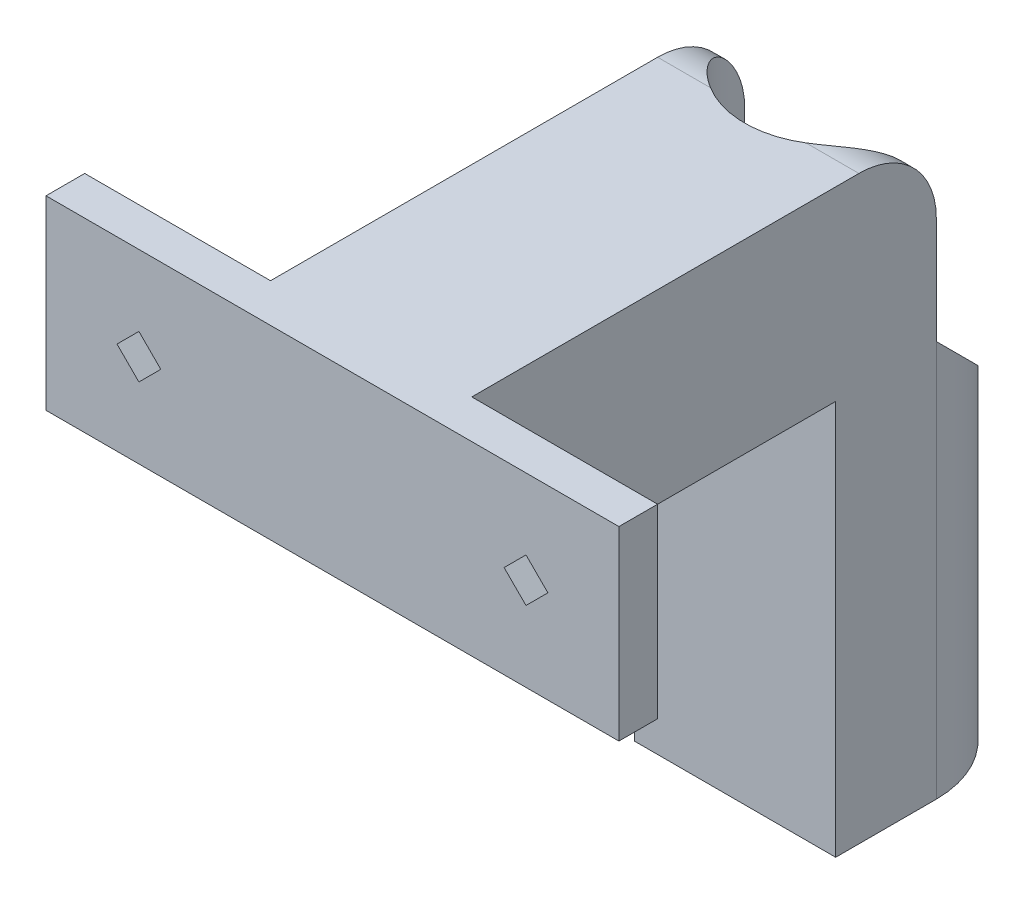
ISO-10303-21;
HEADER;
FILE_DESCRIPTION(('STEP AP214'),'2;1');
FILE_NAME('part.step','',(''),(''),'','','');
FILE_SCHEMA(('AUTOMOTIVE_DESIGN { 1 0 10303 214 1 1 1 1 }'));
ENDSEC;
DATA;
#1=APPLICATION_CONTEXT('core data for automotive mechanical design processes');
#2=APPLICATION_PROTOCOL_DEFINITION('international standard','automotive_design',2000,#1);
#3=PRODUCT_CONTEXT('',#1,'mechanical');
#4=PRODUCT('Part','Part','',(#3));
#5=PRODUCT_RELATED_PRODUCT_CATEGORY('part','',(#4));
#6=PRODUCT_DEFINITION_FORMATION('','',#4);
#7=PRODUCT_DEFINITION_CONTEXT('part definition',#1,'design');
#8=PRODUCT_DEFINITION('design','',#6,#7);
#9=PRODUCT_DEFINITION_SHAPE('','',#8);
#10=(LENGTH_UNIT() NAMED_UNIT(*) SI_UNIT(.MILLI.,.METRE.));
#11=(NAMED_UNIT(*) PLANE_ANGLE_UNIT() SI_UNIT($,.RADIAN.));
#12=(NAMED_UNIT(*) SI_UNIT($,.STERADIAN.) SOLID_ANGLE_UNIT());
#13=UNCERTAINTY_MEASURE_WITH_UNIT(LENGTH_MEASURE(1.E-05),#10,'distance_accuracy_value','');
#14=(GEOMETRIC_REPRESENTATION_CONTEXT(3) GLOBAL_UNCERTAINTY_ASSIGNED_CONTEXT((#13)) GLOBAL_UNIT_ASSIGNED_CONTEXT((#10,
#11,#12)) REPRESENTATION_CONTEXT('',''));
#15=CARTESIAN_POINT('',(0.,0.,0.));
#16=DIRECTION('',(0.,0.,1.));
#17=DIRECTION('',(1.,0.,0.));
#18=AXIS2_PLACEMENT_3D('',#15,#16,#17);
#19=CARTESIAN_POINT('',(0.,1.2,0.));
#20=DIRECTION('',(0.,-1.,0.));
#21=DIRECTION('',(0.,0.,-1.));
#22=AXIS2_PLACEMENT_3D('',#19,#20,#21);
#23=CYLINDRICAL_SURFACE('',#22,13.);
#24=CARTESIAN_POINT('',(0.,51.2,0.));
#25=DIRECTION('',(0.,-0.707106781186547,0.707106781186547));
#26=DIRECTION('',(0.,-0.707106781186548,-0.707106781186548));
#27=AXIS2_PLACEMENT_3D('',#24,#25,#26);
#28=ELLIPSE('',#27,18.3847763108502,13.);
#29=CARTESIAN_POINT('',(-13.,51.2,0.));
#30=VERTEX_POINT('',#29);
#31=CARTESIAN_POINT('',(13.,51.2,0.));
#32=VERTEX_POINT('',#31);
#33=EDGE_CURVE('E217',#30,#32,#28,.T.);
#34=ORIENTED_EDGE('',*,*,#33,.T.);
#35=DIRECTION('',(0.,-1.,0.));
#36=VECTOR('',#35,1.);
#37=CARTESIAN_POINT('',(13.,75.,0.));
#38=LINE('',#37,#36);
#39=CARTESIAN_POINT('',(13.,0.,0.));
#40=VERTEX_POINT('',#39);
#41=EDGE_CURVE('E253',#32,#40,#38,.T.);
#42=ORIENTED_EDGE('',*,*,#41,.T.);
#43=CARTESIAN_POINT('',(0.,0.,0.));
#44=DIRECTION('',(0.,1.,0.));
#45=DIRECTION('',(0.,0.,1.));
#46=AXIS2_PLACEMENT_3D('',#43,#44,#45);
#47=CIRCLE('',#46,13.);
#48=CARTESIAN_POINT('',(-13.,0.,0.));
#49=VERTEX_POINT('',#48);
#50=EDGE_CURVE('E238',#40,#49,#47,.T.);
#51=ORIENTED_EDGE('',*,*,#50,.T.);
#52=DIRECTION('',(0.,-1.,0.));
#53=VECTOR('',#52,1.);
#54=CARTESIAN_POINT('',(-13.,75.,0.));
#55=LINE('',#54,#53);
#56=EDGE_CURVE('E206',#30,#49,#55,.T.);
#57=ORIENTED_EDGE('',*,*,#56,.F.);
#58=EDGE_LOOP('',(#34,#42,#51,#57));
#59=FACE_BOUND('',#58,.T.);
#60=ADVANCED_FACE('F47',(#59),#23,.T.);
#61=CARTESIAN_POINT('',(0.,0.,0.));
#62=DIRECTION('',(0.,1.,0.));
#63=DIRECTION('',(0.,0.,1.));
#64=AXIS2_PLACEMENT_3D('',#61,#62,#63);
#65=PLANE('',#64);
#66=DIRECTION('',(0.,0.,-1.));
#67=VECTOR('',#66,1.);
#68=CARTESIAN_POINT('',(-13.,0.,0.));
#69=LINE('',#68,#67);
#70=CARTESIAN_POINT('',(-13.,0.,13.));
#71=VERTEX_POINT('',#70);
#72=EDGE_CURVE('E245',#71,#49,#69,.T.);
#73=ORIENTED_EDGE('',*,*,#72,.T.);
#74=ORIENTED_EDGE('',*,*,#50,.F.);
#75=DIRECTION('',(0.,0.,1.));
#76=VECTOR('',#75,1.);
#77=CARTESIAN_POINT('',(13.,0.,13.));
#78=LINE('',#77,#76);
#79=CARTESIAN_POINT('',(13.,0.,13.));
#80=VERTEX_POINT('',#79);
#81=EDGE_CURVE('E501',#40,#80,#78,.T.);
#82=ORIENTED_EDGE('',*,*,#81,.T.);
#83=DIRECTION('',(-1.,0.,0.));
#84=VECTOR('',#83,1.);
#85=CARTESIAN_POINT('',(-13.,0.,13.));
#86=LINE('',#85,#84);
#87=EDGE_CURVE('E516',#80,#71,#86,.T.);
#88=ORIENTED_EDGE('',*,*,#87,.T.);
#89=EDGE_LOOP('',(#73,#74,#82,#88));
#90=FACE_BOUND('',#89,.T.);
#91=CARTESIAN_POINT('',(0.,0.,0.));
#92=DIRECTION('',(0.,1.,0.));
#93=DIRECTION('',(0.,0.,1.));
#94=AXIS2_PLACEMENT_3D('',#91,#92,#93);
#95=CIRCLE('',#94,11.25);
#96=CARTESIAN_POINT('',(0.,0.,11.25));
#97=VERTEX_POINT('',#96);
#98=EDGE_CURVE('E265',#97,#97,#95,.T.);
#99=ORIENTED_EDGE('',*,*,#98,.T.);
#100=EDGE_LOOP('',(#99));
#101=FACE_BOUND('',#100,.T.);
#102=ADVANCED_FACE('F312',(#90,#101),#65,.F.);
#103=CARTESIAN_POINT('',(0.,1.2,0.));
#104=DIRECTION('',(0.,-1.,0.));
#105=DIRECTION('',(0.,0.,-1.));
#106=AXIS2_PLACEMENT_3D('',#103,#104,#105);
#107=CYLINDRICAL_SURFACE('',#106,11.25);
#108=CARTESIAN_POINT('',(0.,0.699999999999999,0.));
#109=DIRECTION('',(0.,1.,0.));
#110=DIRECTION('',(0.,0.,1.));
#111=AXIS2_PLACEMENT_3D('',#108,#109,#110);
#112=CIRCLE('',#111,11.25);
#113=CARTESIAN_POINT('',(0.,0.699999999999999,11.25));
#114=VERTEX_POINT('',#113);
#115=EDGE_CURVE('E271',#114,#114,#112,.T.);
#116=ORIENTED_EDGE('',*,*,#115,.T.);
#117=EDGE_LOOP('',(#116));
#118=FACE_BOUND('',#117,.T.);
#119=ORIENTED_EDGE('',*,*,#98,.F.);
#120=EDGE_LOOP('',(#119));
#121=FACE_BOUND('',#120,.T.);
#122=ADVANCED_FACE('F306',(#118,#121),#107,.F.);
#123=CARTESIAN_POINT('',(0.,51.2,0.));
#124=DIRECTION('',(0.,-1.,0.));
#125=DIRECTION('',(0.,0.,-1.));
#126=AXIS2_PLACEMENT_3D('',#123,#124,#125);
#127=CYLINDRICAL_SURFACE('',#126,11.75);
#128=CARTESIAN_POINT('',(0.,75.,0.));
#129=DIRECTION('',(0.,1.,0.));
#130=DIRECTION('',(0.,0.,-1.));
#131=AXIS2_PLACEMENT_3D('',#128,#129,#130);
#132=CIRCLE('',#131,11.75);
#133=CARTESIAN_POINT('',(-6.16948133962654,75.,10.));
#134=VERTEX_POINT('',#133);
#135=CARTESIAN_POINT('',(6.16948133962654,75.,10.));
#136=VERTEX_POINT('',#135);
#137=EDGE_CURVE('E506',#134,#136,#132,.T.);
#138=ORIENTED_EDGE('',*,*,#137,.T.);
#139=CARTESIAN_POINT('',(6.16948133962654,75.,10.));
#140=CARTESIAN_POINT('',(6.40266158098199,74.9999830141259,9.85618063766226));
#141=CARTESIAN_POINT('',(6.63083102619058,74.9968963019697,9.7041137604221));
#142=CARTESIAN_POINT('',(7.07599475002163,74.9823246021824,9.38444110487097));
#143=CARTESIAN_POINT('',(7.29297990457547,74.9708328703382,9.2168229425245));
#144=CARTESIAN_POINT('',(7.71553908185714,74.9370815288869,8.8661624616111));
#145=CARTESIAN_POINT('',(7.9210346431708,74.9147560740994,8.68303155207486));
#146=CARTESIAN_POINT('',(8.3176933753886,74.8569671825217,8.30383726938138));
#147=CARTESIAN_POINT('',(8.50886017939223,74.8215070896998,8.10777719831373));
#148=CARTESIAN_POINT('',(8.87672156111723,74.7349060560823,7.70334390361338));
#149=CARTESIAN_POINT('',(9.05331401751126,74.6836647103496,7.49489894238914));
#150=CARTESIAN_POINT('',(9.38934381185076,74.5634907410541,7.06938518652056));
#151=CARTESIAN_POINT('',(9.5487799836418,74.4945569159671,6.85231580702492));
#152=CARTESIAN_POINT('',(9.84886543554483,74.3376097770726,6.41348056007655));
#153=CARTESIAN_POINT('',(9.98958510810762,74.249671417153,6.19173614632405));
#154=CARTESIAN_POINT('',(10.2523362011237,74.0534247851628,5.74621266086848));
#155=CARTESIAN_POINT('',(10.3743706012252,73.9451197670132,5.5224339196115));
#156=CARTESIAN_POINT('',(10.5860265755118,73.7220742143738,5.10360277051101));
#157=CARTESIAN_POINT('',(10.6777843047284,73.6097085226992,4.90835897607664));
#158=CARTESIAN_POINT('',(10.8471913402563,73.3689747823114,4.52166878028782));
#159=CARTESIAN_POINT('',(10.9248417557852,73.2406079930578,4.33022208143398));
#160=CARTESIAN_POINT('',(11.0668097096519,72.9681825798189,3.95333186018205));
#161=CARTESIAN_POINT('',(11.1311129999855,72.8241074348419,3.76789492951202));
#162=CARTESIAN_POINT('',(11.2472989687455,72.5211381674229,3.40543607941832));
#163=CARTESIAN_POINT('',(11.2991814653223,72.3622438280643,3.22841428322893));
#164=CARTESIAN_POINT('',(11.3899838172906,72.0370563136325,2.89137535176827));
#165=CARTESIAN_POINT('',(11.4293275986718,71.8712873944072,2.73096526887636));
#166=CARTESIAN_POINT('',(11.4989424806982,71.5279932138256,2.42116353078923));
#167=CARTESIAN_POINT('',(11.5292139106293,71.3504683794421,2.27177147583733));
#168=CARTESIAN_POINT('',(11.5819986190501,70.9847347024818,1.98520578614703));
#169=CARTESIAN_POINT('',(11.6045117431547,70.7965256473828,1.84803239459231));
#170=CARTESIAN_POINT('',(11.6430976242441,70.4105276706162,1.58688517490773));
#171=CARTESIAN_POINT('',(11.6591698453266,70.2127379533428,1.46291244574224));
#172=CARTESIAN_POINT('',(11.6874236485499,69.7895549423679,1.21788939656835));
#173=CARTESIAN_POINT('',(11.6990923348145,69.5633218344482,1.09822882766869));
#174=CARTESIAN_POINT('',(11.7177884601259,69.1021773496731,0.876535420966042));
#175=CARTESIAN_POINT('',(11.7248154109301,68.8672650626385,0.774504438370294));
#176=CARTESIAN_POINT('',(11.7356098557461,68.3902476832944,0.588744000731187));
#177=CARTESIAN_POINT('',(11.7393773403169,68.1481425701533,0.505014598698265));
#178=CARTESIAN_POINT('',(11.744829907085,67.6582323761683,0.356385400535703));
#179=CARTESIAN_POINT('',(11.7465153784699,67.4104283694348,0.291482087008681));
#180=CARTESIAN_POINT('',(11.748414256678,66.9831769605217,0.196938277127256));
#181=CARTESIAN_POINT('',(11.7489129639387,66.8047693476349,0.162530660787141));
#182=CARTESIAN_POINT('',(11.749581360677,66.4463647335865,0.103485271407947));
#183=CARTESIAN_POINT('',(11.7497511025363,66.2663679900508,0.0788459434451365));
#184=CARTESIAN_POINT('',(11.7499512064643,65.9055909039686,0.0394389730375228));
#185=CARTESIAN_POINT('',(11.7499817911919,65.7248122768118,0.0246555929253567));
#186=CARTESIAN_POINT('',(11.7499995811828,65.3626896791447,0.0049328062811183));
#187=CARTESIAN_POINT('',(11.7499867794562,65.1813456222417,-5.01385718031361E-06));
#188=CARTESIAN_POINT('',(11.75,65.,0.));
#189=B_SPLINE_CURVE_WITH_KNOTS('',3,(#139,#140,#141,#142,#143,#144,#145,#146,#147,#148,#149,
#150,#151,#152,#153,#154,#155,#156,#157,#158,#159,#160,#161,#162,#163,#164,#165,#166,#167,#168,
#169,#170,#171,#172,#173,#174,#175,#176,#177,#178,#179,#180,#181,#182,#183,#184,#185,#186,#187,
#188),.UNSPECIFIED.,.F.,.F.,(4,2,2,2,2,2,2,2,2,2,2,2,2,2,2,2,2,2,2,2,2,2,2,2,4),(0.,
0.821810556845137,1.64428126141008,2.47181460178943,3.29913740379164,4.13183658715964,
4.96459233541256,5.7941217586964,6.62351876293824,7.3522934754754,8.08101086172393,
8.81050219502508,9.54000420797197,10.2412764766032,10.9425232891065,11.6437840551569,
12.345103156087,13.1128690535767,13.8807156959286,14.648564562315,15.4162698740896,
15.961107747409,16.5058588581564,17.0497380307347,17.5937048303078),.UNSPECIFIED.);
#190=CARTESIAN_POINT('',(11.75,65.,0.));
#191=VERTEX_POINT('',#190);
#192=EDGE_CURVE('E295',#136,#191,#189,.T.);
#193=ORIENTED_EDGE('',*,*,#192,.T.);
#194=DIRECTION('',(0.,-1.,0.));
#195=VECTOR('',#194,1.);
#196=CARTESIAN_POINT('',(11.75,75.,0.));
#197=LINE('',#196,#195);
#198=CARTESIAN_POINT('',(11.75,51.2,0.));
#199=VERTEX_POINT('',#198);
#200=EDGE_CURVE('E254',#191,#199,#197,.T.);
#201=ORIENTED_EDGE('',*,*,#200,.T.);
#202=CARTESIAN_POINT('',(0.,51.2,0.));
#203=DIRECTION('',(0.,-0.707106781186547,0.707106781186547));
#204=DIRECTION('',(0.,-0.707106781186548,-0.707106781186548));
#205=AXIS2_PLACEMENT_3D('',#202,#203,#204);
#206=ELLIPSE('',#205,16.6170093578839,11.75);
#207=CARTESIAN_POINT('',(-11.75,51.2,0.));
#208=VERTEX_POINT('',#207);
#209=EDGE_CURVE('E228',#208,#199,#206,.T.);
#210=ORIENTED_EDGE('',*,*,#209,.F.);
#211=DIRECTION('',(0.,-1.,0.));
#212=VECTOR('',#211,1.);
#213=CARTESIAN_POINT('',(-11.75,75.,0.));
#214=LINE('',#213,#212);
#215=CARTESIAN_POINT('',(-11.75,65.,0.));
#216=VERTEX_POINT('',#215);
#217=EDGE_CURVE('E232',#216,#208,#214,.T.);
#218=ORIENTED_EDGE('',*,*,#217,.F.);
#219=CARTESIAN_POINT('',(-11.75,65.,0.));
#220=CARTESIAN_POINT('',(-11.7499965371992,65.1395973576974,1.26462019771936E-07));
#221=CARTESIAN_POINT('',(-11.7500004450491,65.2791779966651,0.00292356426002779));
#222=CARTESIAN_POINT('',(-11.7499930142584,65.5580910707856,0.0146096083324392));
#223=CARTESIAN_POINT('',(-11.7499816760042,65.697423512137,0.0233720666707813));
#224=CARTESIAN_POINT('',(-11.7498798293156,66.1146747411431,0.0584017854453609));
#225=CARTESIAN_POINT('',(-11.7497215142519,66.3919101238424,0.093411396890569));
#226=CARTESIAN_POINT('',(-11.7486108685653,66.9427342664875,0.186544309738273));
#227=CARTESIAN_POINT('',(-11.7476577017066,67.2163188774708,0.244691920118829));
#228=CARTESIAN_POINT('',(-11.7439394369605,67.7576548639215,0.383690046782253));
#229=CARTESIAN_POINT('',(-11.741174361962,68.025406313032,0.46454027626741));
#230=CARTESIAN_POINT('',(-11.7324545621107,68.5534101469429,0.648449000432577));
#231=CARTESIAN_POINT('',(-11.7264967640579,68.8136550514409,0.751528835305786));
#232=CARTESIAN_POINT('',(-11.7096939635684,69.3244586905109,0.979067651611855));
#233=CARTESIAN_POINT('',(-11.6988491829376,69.5750178641294,1.10352566259338));
#234=CARTESIAN_POINT('',(-11.6703214731058,70.0644080176118,1.37273419147243));
#235=CARTESIAN_POINT('',(-11.652642468044,70.3032456393381,1.51747303398196));
#236=CARTESIAN_POINT('',(-11.6082962668349,70.7674226866755,1.82598762506047));
#237=CARTESIAN_POINT('',(-11.5816294820293,70.9927627294715,1.98976250218702));
#238=CARTESIAN_POINT('',(-11.517989056755,71.4217618964495,2.32968767564317));
#239=CARTESIAN_POINT('',(-11.4813351514935,71.6258590965344,2.50534428293626));
#240=CARTESIAN_POINT('',(-11.3953795353614,72.0178573356512,2.87107879762738));
#241=CARTESIAN_POINT('',(-11.3460780396367,72.2057586501158,3.06115645967271));
#242=CARTESIAN_POINT('',(-11.2329771539679,72.5636770605852,3.45315598472037));
#243=CARTESIAN_POINT('',(-11.1691905246128,72.7337097061783,3.65506730747053));
#244=CARTESIAN_POINT('',(-11.0254920230453,73.0548113575989,4.06801929274257));
#245=CARTESIAN_POINT('',(-10.9455821248242,73.205882681215,4.27905883520291));
#246=CARTESIAN_POINT('',(-10.7777619275591,73.4734324943353,4.68458491211026));
#247=CARTESIAN_POINT('',(-10.6915676565688,73.5918770824694,4.87848842162282));
#248=CARTESIAN_POINT('',(-10.5048490485116,73.8126824320029,5.26852684735541));
#249=CARTESIAN_POINT('',(-10.404325805759,73.9150444203885,5.46466159212273));
#250=CARTESIAN_POINT('',(-10.1888488646192,74.103824788442,5.85660852199295));
#251=CARTESIAN_POINT('',(-10.0738978154955,74.1902460879957,6.05242075964471));
#252=CARTESIAN_POINT('',(-9.82977642105442,74.347720051972,6.44132775257337));
#253=CARTESIAN_POINT('',(-9.70060610309224,74.4187727459602,6.6344225130774));
#254=CARTESIAN_POINT('',(-9.4340535310504,74.5438457039738,7.00797055514693));
#255=CARTESIAN_POINT('',(-9.29721168458777,74.5984367860884,7.18861973482996));
#256=CARTESIAN_POINT('',(-9.01156193077378,74.6953620512813,7.54361732210034));
#257=CARTESIAN_POINT('',(-8.86275388469896,74.7376960922383,7.71796565660838));
#258=CARTESIAN_POINT('',(-8.55381888114973,74.8113722756964,8.0590110220483));
#259=CARTESIAN_POINT('',(-8.39368328179669,74.8427059148331,8.22570204771734));
#260=CARTESIAN_POINT('',(-8.06307263662955,74.8956855079735,8.55002996711294));
#261=CARTESIAN_POINT('',(-7.89259883722383,74.9173326271905,8.7076679478611));
#262=CARTESIAN_POINT('',(-7.47556020405127,74.9590008122018,9.07089802498266));
#263=CARTESIAN_POINT('',(-7.22466522650883,74.9752889547426,9.27199274365993));
#264=CARTESIAN_POINT('',(-6.83691335115615,74.9906554679189,9.55744872635918));
#265=CARTESIAN_POINT('',(-6.70597492996799,74.9942680848538,9.64977115208216));
#266=CARTESIAN_POINT('',(-6.44043079809625,74.9989384332433,9.8289869305839));
#267=CARTESIAN_POINT('',(-6.30582591275237,74.9999967349586,9.91588149093378));
#268=CARTESIAN_POINT('',(-6.16948133962654,75.,10.));
#269=B_SPLINE_CURVE_WITH_KNOTS('',3,(#219,#220,#221,#222,#223,#224,#225,#226,#227,#228,#229,
#230,#231,#232,#233,#234,#235,#236,#237,#238,#239,#240,#241,#242,#243,#244,#245,#246,#247,#248,
#249,#250,#251,#252,#253,#254,#255,#256,#257,#258,#259,#260,#261,#262,#263,#264,#265,#266,#267,
#268),.UNSPECIFIED.,.F.,.F.,(4,2,2,2,2,2,2,2,2,2,2,2,2,2,2,2,2,2,2,2,2,2,2,2,4),(0.,
0.418728081542564,0.837445554691536,1.67469302663844,2.51282245018575,3.35094128628558,
4.18986831823695,5.02875727758552,5.86716526955276,6.70553489550677,7.51970431927634,
8.33385989427405,9.1473010073169,9.96064259014166,10.6887481953605,11.416798224373,
12.1447147623811,12.8726299000348,13.5712224742447,14.2698231483664,14.9689626612968,
15.6680180505335,16.6322957462067,17.1129326694489,17.5934622787243),.UNSPECIFIED.);
#270=EDGE_CURVE('E70',#216,#134,#269,.T.);
#271=ORIENTED_EDGE('',*,*,#270,.T.);
#272=EDGE_LOOP('',(#138,#193,#201,#210,#218,#271));
#273=FACE_BOUND('',#272,.T.);
#274=CARTESIAN_POINT('',(0.,1.2,0.));
#275=DIRECTION('',(0.,1.,0.));
#276=DIRECTION('',(0.,0.,1.));
#277=AXIS2_PLACEMENT_3D('',#274,#275,#276);
#278=CIRCLE('',#277,11.75);
#279=CARTESIAN_POINT('',(0.,1.2,11.75));
#280=VERTEX_POINT('',#279);
#281=EDGE_CURVE('E234',#280,#280,#278,.T.);
#282=ORIENTED_EDGE('',*,*,#281,.F.);
#283=EDGE_LOOP('',(#282));
#284=FACE_BOUND('',#283,.T.);
#285=ADVANCED_FACE('F300',(#273,#284),#127,.F.);
#286=CARTESIAN_POINT('',(0.,0.699999999999999,0.));
#287=DIRECTION('',(0.,1.,0.));
#288=DIRECTION('',(0.,0.,1.));
#289=AXIS2_PLACEMENT_3D('',#286,#287,#288);
#290=CONICAL_SURFACE('',#289,11.25,0.785398163397455);
#291=ORIENTED_EDGE('',*,*,#281,.T.);
#292=EDGE_LOOP('',(#291));
#293=FACE_BOUND('',#292,.T.);
#294=ORIENTED_EDGE('',*,*,#115,.F.);
#295=EDGE_LOOP('',(#294));
#296=FACE_BOUND('',#295,.T.);
#297=ADVANCED_FACE('F305',(#293,#296),#290,.F.);
#298=CARTESIAN_POINT('',(-13.,75.,0.));
#299=DIRECTION('',(0.,0.,-1.));
#300=DIRECTION('',(-1.,0.,0.));
#301=AXIS2_PLACEMENT_3D('',#298,#299,#300);
#302=PLANE('',#301);
#303=CARTESIAN_POINT('',(-13.,65.,0.));
#304=VERTEX_POINT('',#303);
#305=EDGE_CURVE('E201',#304,#30,#55,.T.);
#306=ORIENTED_EDGE('',*,*,#305,.F.);
#307=DIRECTION('',(1.,0.,0.));
#308=VECTOR('',#307,1.);
#309=CARTESIAN_POINT('',(-11.75,65.,0.));
#310=LINE('',#309,#308);
#311=EDGE_CURVE('E57',#304,#216,#310,.T.);
#312=ORIENTED_EDGE('',*,*,#311,.T.);
#313=ORIENTED_EDGE('',*,*,#217,.T.);
#314=DIRECTION('',(-1.,0.,0.));
#315=VECTOR('',#314,1.);
#316=CARTESIAN_POINT('',(0.,51.2,0.));
#317=LINE('',#316,#315);
#318=EDGE_CURVE('E220',#208,#30,#317,.T.);
#319=ORIENTED_EDGE('',*,*,#318,.T.);
#320=EDGE_LOOP('',(#306,#312,#313,#319));
#321=FACE_BOUND('',#320,.T.);
#322=ADVANCED_FACE('F230',(#321),#302,.T.);
#323=CARTESIAN_POINT('',(-13.,75.,0.));
#324=DIRECTION('',(-1.,0.,0.));
#325=DIRECTION('',(0.,0.,1.));
#326=AXIS2_PLACEMENT_3D('',#323,#324,#325);
#327=PLANE('',#326);
#328=DIRECTION('',(0.,0.,-1.));
#329=VECTOR('',#328,1.);
#330=CARTESIAN_POINT('',(-13.,75.,0.));
#331=LINE('',#330,#329);
#332=CARTESIAN_POINT('',(-13.,75.,60.));
#333=VERTEX_POINT('',#332);
#334=CARTESIAN_POINT('',(-13.,75.,9.99999999999999));
#335=VERTEX_POINT('',#334);
#336=EDGE_CURVE('E259',#333,#335,#331,.T.);
#337=ORIENTED_EDGE('',*,*,#336,.T.);
#338=CARTESIAN_POINT('',(-13.,65.,10.));
#339=DIRECTION('',(-1.,0.,0.));
#340=DIRECTION('',(0.,0.,1.));
#341=AXIS2_PLACEMENT_3D('',#338,#339,#340);
#342=CIRCLE('',#341,10.);
#343=EDGE_CURVE('E11',#335,#304,#342,.T.);
#344=ORIENTED_EDGE('',*,*,#343,.T.);
#345=ORIENTED_EDGE('',*,*,#305,.T.);
#346=ORIENTED_EDGE('',*,*,#56,.T.);
#347=ORIENTED_EDGE('',*,*,#72,.F.);
#348=DIRECTION('',(0.,-1.,0.));
#349=VECTOR('',#348,1.);
#350=CARTESIAN_POINT('',(-13.,75.,13.));
#351=LINE('',#350,#349);
#352=CARTESIAN_POINT('',(-13.,51.,13.));
#353=VERTEX_POINT('',#352);
#354=EDGE_CURVE('E240',#353,#71,#351,.T.);
#355=ORIENTED_EDGE('',*,*,#354,.F.);
#356=DIRECTION('',(0.,0.,-1.));
#357=VECTOR('',#356,1.);
#358=CARTESIAN_POINT('',(-13.,51.,13.));
#359=LINE('',#358,#357);
#360=CARTESIAN_POINT('',(-13.,51.,60.));
#361=VERTEX_POINT('',#360);
#362=EDGE_CURVE('E493',#361,#353,#359,.T.);
#363=ORIENTED_EDGE('',*,*,#362,.F.);
#364=DIRECTION('',(0.,1.,0.));
#365=VECTOR('',#364,1.);
#366=CARTESIAN_POINT('',(-13.,75.,60.));
#367=LINE('',#366,#365);
#368=EDGE_CURVE('E463',#361,#333,#367,.T.);
#369=ORIENTED_EDGE('',*,*,#368,.T.);
#370=EDGE_LOOP('',(#337,#344,#345,#346,#347,#355,#363,#369));
#371=FACE_BOUND('',#370,.T.);
#372=ADVANCED_FACE('F203',(#371),#327,.T.);
#373=CARTESIAN_POINT('',(-13.,75.,13.));
#374=DIRECTION('',(0.,0.,1.));
#375=DIRECTION('',(1.,0.,0.));
#376=AXIS2_PLACEMENT_3D('',#373,#374,#375);
#377=PLANE('',#376);
#378=DIRECTION('',(1.,0.,0.));
#379=VECTOR('',#378,1.);
#380=CARTESIAN_POINT('',(-70.2712842531054,51.,13.));
#381=LINE('',#380,#379);
#382=CARTESIAN_POINT('',(13.,51.,13.));
#383=VERTEX_POINT('',#382);
#384=EDGE_CURVE('E496',#353,#383,#381,.T.);
#385=ORIENTED_EDGE('',*,*,#384,.F.);
#386=ORIENTED_EDGE('',*,*,#354,.T.);
#387=ORIENTED_EDGE('',*,*,#87,.F.);
#388=DIRECTION('',(0.,-1.,0.));
#389=VECTOR('',#388,1.);
#390=CARTESIAN_POINT('',(13.,75.,13.));
#391=LINE('',#390,#389);
#392=EDGE_CURVE('E242',#383,#80,#391,.T.);
#393=ORIENTED_EDGE('',*,*,#392,.F.);
#394=EDGE_LOOP('',(#385,#386,#387,#393));
#395=FACE_BOUND('',#394,.T.);
#396=ADVANCED_FACE('F526',(#395),#377,.T.);
#397=CARTESIAN_POINT('',(13.,75.,13.));
#398=DIRECTION('',(1.,0.,0.));
#399=DIRECTION('',(0.,0.,-1.));
#400=AXIS2_PLACEMENT_3D('',#397,#398,#399);
#401=PLANE('',#400);
#402=CARTESIAN_POINT('',(13.,65.,0.));
#403=VERTEX_POINT('',#402);
#404=EDGE_CURVE('E250',#403,#32,#38,.T.);
#405=ORIENTED_EDGE('',*,*,#404,.F.);
#406=CARTESIAN_POINT('',(13.,65.,10.));
#407=DIRECTION('',(1.,0.,0.));
#408=DIRECTION('',(0.,0.,-1.));
#409=AXIS2_PLACEMENT_3D('',#406,#407,#408);
#410=CIRCLE('',#409,10.);
#411=CARTESIAN_POINT('',(13.,75.,10.));
#412=VERTEX_POINT('',#411);
#413=EDGE_CURVE('E279',#403,#412,#410,.T.);
#414=ORIENTED_EDGE('',*,*,#413,.T.);
#415=DIRECTION('',(0.,0.,1.));
#416=VECTOR('',#415,1.);
#417=CARTESIAN_POINT('',(13.,75.,13.));
#418=LINE('',#417,#416);
#419=CARTESIAN_POINT('',(13.,75.,60.));
#420=VERTEX_POINT('',#419);
#421=EDGE_CURVE('E509',#412,#420,#418,.T.);
#422=ORIENTED_EDGE('',*,*,#421,.T.);
#423=DIRECTION('',(0.,-1.,0.));
#424=VECTOR('',#423,1.);
#425=CARTESIAN_POINT('',(13.,51.,60.));
#426=LINE('',#425,#424);
#427=CARTESIAN_POINT('',(13.,51.,60.));
#428=VERTEX_POINT('',#427);
#429=EDGE_CURVE('E360',#420,#428,#426,.T.);
#430=ORIENTED_EDGE('',*,*,#429,.T.);
#431=DIRECTION('',(0.,0.,-1.));
#432=VECTOR('',#431,1.);
#433=CARTESIAN_POINT('',(13.,51.,13.));
#434=LINE('',#433,#432);
#435=EDGE_CURVE('E486',#428,#383,#434,.T.);
#436=ORIENTED_EDGE('',*,*,#435,.T.);
#437=ORIENTED_EDGE('',*,*,#392,.T.);
#438=ORIENTED_EDGE('',*,*,#81,.F.);
#439=ORIENTED_EDGE('',*,*,#41,.F.);
#440=EDGE_LOOP('',(#405,#414,#422,#430,#436,#437,#438,#439));
#441=FACE_BOUND('',#440,.T.);
#442=ADVANCED_FACE('F543',(#441),#401,.T.);
#443=CARTESIAN_POINT('',(13.,75.,0.));
#444=DIRECTION('',(0.,0.,-1.));
#445=DIRECTION('',(-1.,0.,0.));
#446=AXIS2_PLACEMENT_3D('',#443,#444,#445);
#447=PLANE('',#446);
#448=ORIENTED_EDGE('',*,*,#200,.F.);
#449=DIRECTION('',(1.,0.,0.));
#450=VECTOR('',#449,1.);
#451=CARTESIAN_POINT('',(13.,65.,0.));
#452=LINE('',#451,#450);
#453=EDGE_CURVE('E275',#191,#403,#452,.T.);
#454=ORIENTED_EDGE('',*,*,#453,.T.);
#455=ORIENTED_EDGE('',*,*,#404,.T.);
#456=DIRECTION('',(-1.,0.,0.));
#457=VECTOR('',#456,1.);
#458=CARTESIAN_POINT('',(0.,51.2,0.));
#459=LINE('',#458,#457);
#460=EDGE_CURVE('E211',#32,#199,#459,.T.);
#461=ORIENTED_EDGE('',*,*,#460,.T.);
#462=EDGE_LOOP('',(#448,#454,#455,#461));
#463=FACE_BOUND('',#462,.T.);
#464=ADVANCED_FACE('F572',(#463),#447,.T.);
#465=CARTESIAN_POINT('',(0.,75.,0.));
#466=DIRECTION('',(0.,-1.,0.));
#467=DIRECTION('',(0.,0.,-1.));
#468=AXIS2_PLACEMENT_3D('',#465,#466,#467);
#469=PLANE('',#468);
#470=ORIENTED_EDGE('',*,*,#421,.F.);
#471=DIRECTION('',(1.,0.,0.));
#472=VECTOR('',#471,1.);
#473=CARTESIAN_POINT('',(11.75,75.,10.));
#474=LINE('',#473,#472);
#475=EDGE_CURVE('E285',#412,#136,#474,.F.);
#476=ORIENTED_EDGE('',*,*,#475,.T.);
#477=ORIENTED_EDGE('',*,*,#137,.F.);
#478=DIRECTION('',(1.,0.,0.));
#479=VECTOR('',#478,1.);
#480=CARTESIAN_POINT('',(-13.,75.,10.));
#481=LINE('',#480,#479);
#482=EDGE_CURVE('E282',#134,#335,#481,.F.);
#483=ORIENTED_EDGE('',*,*,#482,.T.);
#484=ORIENTED_EDGE('',*,*,#336,.F.);
#485=DIRECTION('',(-1.,0.,0.));
#486=VECTOR('',#485,1.);
#487=CARTESIAN_POINT('',(-13.,75.,60.));
#488=LINE('',#487,#486);
#489=CARTESIAN_POINT('',(-37.,75.,60.));
#490=VERTEX_POINT('',#489);
#491=EDGE_CURVE('E467',#333,#490,#488,.T.);
#492=ORIENTED_EDGE('',*,*,#491,.T.);
#493=DIRECTION('',(0.,0.,1.));
#494=VECTOR('',#493,1.);
#495=CARTESIAN_POINT('',(-37.,75.,60.));
#496=LINE('',#495,#494);
#497=CARTESIAN_POINT('',(-37.,75.,65.));
#498=VERTEX_POINT('',#497);
#499=EDGE_CURVE('E478',#490,#498,#496,.T.);
#500=ORIENTED_EDGE('',*,*,#499,.T.);
#501=DIRECTION('',(1.,0.,0.));
#502=VECTOR('',#501,1.);
#503=CARTESIAN_POINT('',(-70.2712842531054,75.,65.));
#504=LINE('',#503,#502);
#505=CARTESIAN_POINT('',(37.,75.,65.));
#506=VERTEX_POINT('',#505);
#507=EDGE_CURVE('E492',#498,#506,#504,.T.);
#508=ORIENTED_EDGE('',*,*,#507,.T.);
#509=DIRECTION('',(0.,0.,1.));
#510=VECTOR('',#509,1.);
#511=CARTESIAN_POINT('',(37.,75.,60.));
#512=LINE('',#511,#510);
#513=CARTESIAN_POINT('',(37.,75.,60.));
#514=VERTEX_POINT('',#513);
#515=EDGE_CURVE('E227',#514,#506,#512,.T.);
#516=ORIENTED_EDGE('',*,*,#515,.F.);
#517=DIRECTION('',(-1.,0.,0.));
#518=VECTOR('',#517,1.);
#519=CARTESIAN_POINT('',(13.,75.,60.));
#520=LINE('',#519,#518);
#521=EDGE_CURVE('E351',#514,#420,#520,.T.);
#522=ORIENTED_EDGE('',*,*,#521,.T.);
#523=EDGE_LOOP('',(#470,#476,#477,#483,#484,#492,#500,#508,#516,#522));
#524=FACE_BOUND('',#523,.T.);
#525=ADVANCED_FACE('F538',(#524),#469,.F.);
#526=CARTESIAN_POINT('',(-70.2712842531054,75.,65.));
#527=DIRECTION('',(0.,0.,1.));
#528=DIRECTION('',(1.,0.,0.));
#529=AXIS2_PLACEMENT_3D('',#526,#527,#528);
#530=PLANE('',#529);
#531=ORIENTED_EDGE('',*,*,#507,.F.);
#532=DIRECTION('',(0.,-1.,0.));
#533=VECTOR('',#532,1.);
#534=CARTESIAN_POINT('',(-37.,75.,65.));
#535=LINE('',#534,#533);
#536=CARTESIAN_POINT('',(-37.,51.,65.));
#537=VERTEX_POINT('',#536);
#538=EDGE_CURVE('E453',#498,#537,#535,.T.);
#539=ORIENTED_EDGE('',*,*,#538,.T.);
#540=DIRECTION('',(1.,0.,0.));
#541=VECTOR('',#540,1.);
#542=CARTESIAN_POINT('',(-70.2712842531054,51.,65.));
#543=LINE('',#542,#541);
#544=CARTESIAN_POINT('',(37.,51.,65.));
#545=VERTEX_POINT('',#544);
#546=EDGE_CURVE('E497',#537,#545,#543,.T.);
#547=ORIENTED_EDGE('',*,*,#546,.T.);
#548=DIRECTION('',(0.,1.,0.));
#549=VECTOR('',#548,1.);
#550=CARTESIAN_POINT('',(37.,51.,65.));
#551=LINE('',#550,#549);
#552=EDGE_CURVE('E355',#545,#506,#551,.T.);
#553=ORIENTED_EDGE('',*,*,#552,.T.);
#554=EDGE_LOOP('',(#531,#539,#547,#553));
#555=FACE_BOUND('',#554,.T.);
#556=DIRECTION('',(0.707106781186549,0.707106781186546,0.));
#557=VECTOR('',#556,1.);
#558=CARTESIAN_POINT('',(-25.,60.1715728752538,65.));
#559=LINE('',#558,#557);
#560=CARTESIAN_POINT('',(-25.,60.1715728752538,65.));
#561=VERTEX_POINT('',#560);
#562=CARTESIAN_POINT('',(-22.1715728752538,63.,65.));
#563=VERTEX_POINT('',#562);
#564=EDGE_CURVE('E439',#561,#563,#559,.T.);
#565=ORIENTED_EDGE('',*,*,#564,.F.);
#566=DIRECTION('',(0.707106781186546,-0.707106781186549,0.));
#567=VECTOR('',#566,1.);
#568=CARTESIAN_POINT('',(-27.8284271247462,63.,65.));
#569=LINE('',#568,#567);
#570=CARTESIAN_POINT('',(-27.8284271247462,63.,65.));
#571=VERTEX_POINT('',#570);
#572=EDGE_CURVE('E404',#571,#561,#569,.T.);
#573=ORIENTED_EDGE('',*,*,#572,.F.);
#574=DIRECTION('',(-0.707106781186549,-0.707106781186546,0.));
#575=VECTOR('',#574,1.);
#576=CARTESIAN_POINT('',(-27.8284271247462,63.,65.));
#577=LINE('',#576,#575);
#578=CARTESIAN_POINT('',(-25.,65.8284271247462,65.));
#579=VERTEX_POINT('',#578);
#580=EDGE_CURVE('E424',#579,#571,#577,.T.);
#581=ORIENTED_EDGE('',*,*,#580,.F.);
#582=DIRECTION('',(-0.707106781186549,0.707106781186546,0.));
#583=VECTOR('',#582,1.);
#584=CARTESIAN_POINT('',(-25.,65.8284271247462,65.));
#585=LINE('',#584,#583);
#586=EDGE_CURVE('E443',#563,#579,#585,.T.);
#587=ORIENTED_EDGE('',*,*,#586,.F.);
#588=EDGE_LOOP('',(#565,#573,#581,#587));
#589=FACE_BOUND('',#588,.T.);
#590=DIRECTION('',(0.707106781186548,0.707106781186547,0.));
#591=VECTOR('',#590,1.);
#592=CARTESIAN_POINT('',(25.,60.1715728752538,65.));
#593=LINE('',#592,#591);
#594=CARTESIAN_POINT('',(25.,60.1715728752538,65.));
#595=VERTEX_POINT('',#594);
#596=CARTESIAN_POINT('',(27.8284271247462,63.,65.));
#597=VERTEX_POINT('',#596);
#598=EDGE_CURVE('E397',#595,#597,#593,.T.);
#599=ORIENTED_EDGE('',*,*,#598,.F.);
#600=DIRECTION('',(0.707106781186547,-0.707106781186547,0.));
#601=VECTOR('',#600,1.);
#602=CARTESIAN_POINT('',(22.1715728752538,63.,65.));
#603=LINE('',#602,#601);
#604=CARTESIAN_POINT('',(22.1715728752538,63.,65.));
#605=VERTEX_POINT('',#604);
#606=EDGE_CURVE('E401',#605,#595,#603,.T.);
#607=ORIENTED_EDGE('',*,*,#606,.F.);
#608=DIRECTION('',(-0.707106781186548,-0.707106781186548,0.));
#609=VECTOR('',#608,1.);
#610=CARTESIAN_POINT('',(22.1715728752538,63.,65.));
#611=LINE('',#610,#609);
#612=CARTESIAN_POINT('',(25.,65.8284271247462,65.));
#613=VERTEX_POINT('',#612);
#614=EDGE_CURVE('E388',#613,#605,#611,.T.);
#615=ORIENTED_EDGE('',*,*,#614,.F.);
#616=DIRECTION('',(-0.707106781186547,0.707106781186548,0.));
#617=VECTOR('',#616,1.);
#618=CARTESIAN_POINT('',(25.,65.8284271247462,65.));
#619=LINE('',#618,#617);
#620=EDGE_CURVE('E392',#597,#613,#619,.T.);
#621=ORIENTED_EDGE('',*,*,#620,.F.);
#622=EDGE_LOOP('',(#599,#607,#615,#621));
#623=FACE_BOUND('',#622,.T.);
#624=ADVANCED_FACE('F552',(#555,#589,#623),#530,.T.);
#625=CARTESIAN_POINT('',(-70.2712842531054,51.,13.));
#626=DIRECTION('',(0.,-1.,0.));
#627=DIRECTION('',(0.,0.,-1.));
#628=AXIS2_PLACEMENT_3D('',#625,#626,#627);
#629=PLANE('',#628);
#630=ORIENTED_EDGE('',*,*,#546,.F.);
#631=DIRECTION('',(0.,0.,1.));
#632=VECTOR('',#631,1.);
#633=CARTESIAN_POINT('',(-37.,51.,60.));
#634=LINE('',#633,#632);
#635=CARTESIAN_POINT('',(-37.,51.,60.));
#636=VERTEX_POINT('',#635);
#637=EDGE_CURVE('E482',#636,#537,#634,.T.);
#638=ORIENTED_EDGE('',*,*,#637,.F.);
#639=DIRECTION('',(1.,0.,0.));
#640=VECTOR('',#639,1.);
#641=CARTESIAN_POINT('',(-13.,51.,60.));
#642=LINE('',#641,#640);
#643=EDGE_CURVE('E475',#636,#361,#642,.T.);
#644=ORIENTED_EDGE('',*,*,#643,.T.);
#645=ORIENTED_EDGE('',*,*,#362,.T.);
#646=ORIENTED_EDGE('',*,*,#384,.T.);
#647=ORIENTED_EDGE('',*,*,#435,.F.);
#648=DIRECTION('',(1.,0.,0.));
#649=VECTOR('',#648,1.);
#650=CARTESIAN_POINT('',(13.,51.,60.));
#651=LINE('',#650,#649);
#652=CARTESIAN_POINT('',(37.,51.,60.));
#653=VERTEX_POINT('',#652);
#654=EDGE_CURVE('E368',#428,#653,#651,.T.);
#655=ORIENTED_EDGE('',*,*,#654,.T.);
#656=DIRECTION('',(0.,0.,1.));
#657=VECTOR('',#656,1.);
#658=CARTESIAN_POINT('',(37.,51.,60.));
#659=LINE('',#658,#657);
#660=EDGE_CURVE('E347',#653,#545,#659,.T.);
#661=ORIENTED_EDGE('',*,*,#660,.T.);
#662=EDGE_LOOP('',(#630,#638,#644,#645,#646,#647,#655,#661));
#663=FACE_BOUND('',#662,.T.);
#664=ADVANCED_FACE('F529',(#663),#629,.T.);
#665=CARTESIAN_POINT('',(-37.,75.,60.));
#666=DIRECTION('',(-1.,0.,0.));
#667=DIRECTION('',(0.,0.,1.));
#668=AXIS2_PLACEMENT_3D('',#665,#666,#667);
#669=PLANE('',#668);
#670=ORIENTED_EDGE('',*,*,#538,.F.);
#671=ORIENTED_EDGE('',*,*,#499,.F.);
#672=DIRECTION('',(0.,-1.,0.));
#673=VECTOR('',#672,1.);
#674=CARTESIAN_POINT('',(-37.,75.,60.));
#675=LINE('',#674,#673);
#676=EDGE_CURVE('E471',#490,#636,#675,.T.);
#677=ORIENTED_EDGE('',*,*,#676,.T.);
#678=ORIENTED_EDGE('',*,*,#637,.T.);
#679=EDGE_LOOP('',(#670,#671,#677,#678));
#680=FACE_BOUND('',#679,.T.);
#681=ADVANCED_FACE('F556',(#680),#669,.T.);
#682=CARTESIAN_POINT('',(0.,0.,60.));
#683=DIRECTION('',(0.,0.,-1.));
#684=DIRECTION('',(-1.,0.,0.));
#685=AXIS2_PLACEMENT_3D('',#682,#683,#684);
#686=PLANE('',#685);
#687=DIRECTION('',(0.707106781186546,-0.707106781186549,0.));
#688=VECTOR('',#687,1.);
#689=CARTESIAN_POINT('',(-27.8284271247462,63.,60.));
#690=LINE('',#689,#688);
#691=CARTESIAN_POINT('',(-27.8284271247462,63.,60.));
#692=VERTEX_POINT('',#691);
#693=CARTESIAN_POINT('',(-25.,60.1715728752538,60.));
#694=VERTEX_POINT('',#693);
#695=EDGE_CURVE('E419',#692,#694,#690,.T.);
#696=ORIENTED_EDGE('',*,*,#695,.T.);
#697=DIRECTION('',(0.707106781186549,0.707106781186546,0.));
#698=VECTOR('',#697,1.);
#699=CARTESIAN_POINT('',(-25.,60.1715728752538,60.));
#700=LINE('',#699,#698);
#701=CARTESIAN_POINT('',(-22.1715728752538,63.,60.));
#702=VERTEX_POINT('',#701);
#703=EDGE_CURVE('E423',#694,#702,#700,.T.);
#704=ORIENTED_EDGE('',*,*,#703,.T.);
#705=DIRECTION('',(-0.707106781186549,0.707106781186546,0.));
#706=VECTOR('',#705,1.);
#707=CARTESIAN_POINT('',(-25.,65.8284271247462,60.));
#708=LINE('',#707,#706);
#709=CARTESIAN_POINT('',(-25.,65.8284271247462,60.));
#710=VERTEX_POINT('',#709);
#711=EDGE_CURVE('E428',#702,#710,#708,.T.);
#712=ORIENTED_EDGE('',*,*,#711,.T.);
#713=DIRECTION('',(-0.707106781186549,-0.707106781186546,0.));
#714=VECTOR('',#713,1.);
#715=CARTESIAN_POINT('',(-27.8284271247462,63.,60.));
#716=LINE('',#715,#714);
#717=EDGE_CURVE('E432',#710,#692,#716,.T.);
#718=ORIENTED_EDGE('',*,*,#717,.T.);
#719=EDGE_LOOP('',(#696,#704,#712,#718));
#720=FACE_BOUND('',#719,.T.);
#721=ORIENTED_EDGE('',*,*,#368,.F.);
#722=ORIENTED_EDGE('',*,*,#643,.F.);
#723=ORIENTED_EDGE('',*,*,#676,.F.);
#724=ORIENTED_EDGE('',*,*,#491,.F.);
#725=EDGE_LOOP('',(#721,#722,#723,#724));
#726=FACE_BOUND('',#725,.T.);
#727=ADVANCED_FACE('F534',(#720,#726),#686,.T.);
#728=CARTESIAN_POINT('',(-27.8284271247462,63.,60.));
#729=DIRECTION('',(-0.707106781186549,-0.707106781186546,0.));
#730=DIRECTION('',(0.707106781186546,-0.707106781186549,0.));
#731=AXIS2_PLACEMENT_3D('',#728,#729,#730);
#732=PLANE('',#731);
#733=ORIENTED_EDGE('',*,*,#572,.T.);
#734=DIRECTION('',(0.,0.,1.));
#735=VECTOR('',#734,1.);
#736=CARTESIAN_POINT('',(-25.,60.1715728752538,60.));
#737=LINE('',#736,#735);
#738=EDGE_CURVE('E436',#694,#561,#737,.T.);
#739=ORIENTED_EDGE('',*,*,#738,.F.);
#740=ORIENTED_EDGE('',*,*,#695,.F.);
#741=DIRECTION('',(0.,0.,1.));
#742=VECTOR('',#741,1.);
#743=CARTESIAN_POINT('',(-27.8284271247462,63.,60.));
#744=LINE('',#743,#742);
#745=EDGE_CURVE('E450',#692,#571,#744,.T.);
#746=ORIENTED_EDGE('',*,*,#745,.T.);
#747=EDGE_LOOP('',(#733,#739,#740,#746));
#748=FACE_BOUND('',#747,.T.);
#749=ADVANCED_FACE('F563',(#748),#732,.F.);
#750=CARTESIAN_POINT('',(-27.8284271247462,63.,60.));
#751=DIRECTION('',(-0.707106781186546,0.707106781186549,0.));
#752=DIRECTION('',(-0.707106781186549,-0.707106781186546,0.));
#753=AXIS2_PLACEMENT_3D('',#750,#751,#752);
#754=PLANE('',#753);
#755=ORIENTED_EDGE('',*,*,#580,.T.);
#756=ORIENTED_EDGE('',*,*,#745,.F.);
#757=ORIENTED_EDGE('',*,*,#717,.F.);
#758=DIRECTION('',(0.,0.,1.));
#759=VECTOR('',#758,1.);
#760=CARTESIAN_POINT('',(-25.,65.8284271247462,60.));
#761=LINE('',#760,#759);
#762=EDGE_CURVE('E454',#710,#579,#761,.T.);
#763=ORIENTED_EDGE('',*,*,#762,.T.);
#764=EDGE_LOOP('',(#755,#756,#757,#763));
#765=FACE_BOUND('',#764,.T.);
#766=ADVANCED_FACE('F636',(#765),#754,.F.);
#767=CARTESIAN_POINT('',(-25.,65.8284271247462,60.));
#768=DIRECTION('',(0.707106781186546,0.707106781186549,0.));
#769=DIRECTION('',(-0.707106781186549,0.707106781186546,0.));
#770=AXIS2_PLACEMENT_3D('',#767,#768,#769);
#771=PLANE('',#770);
#772=ORIENTED_EDGE('',*,*,#586,.T.);
#773=ORIENTED_EDGE('',*,*,#762,.F.);
#774=ORIENTED_EDGE('',*,*,#711,.F.);
#775=DIRECTION('',(0.,0.,1.));
#776=VECTOR('',#775,1.);
#777=CARTESIAN_POINT('',(-22.1715728752538,63.,60.));
#778=LINE('',#777,#776);
#779=EDGE_CURVE('E457',#702,#563,#778,.T.);
#780=ORIENTED_EDGE('',*,*,#779,.T.);
#781=EDGE_LOOP('',(#772,#773,#774,#780));
#782=FACE_BOUND('',#781,.T.);
#783=ADVANCED_FACE('F645',(#782),#771,.F.);
#784=CARTESIAN_POINT('',(-25.,60.1715728752538,60.));
#785=DIRECTION('',(0.707106781186546,-0.707106781186549,0.));
#786=DIRECTION('',(0.707106781186549,0.707106781186546,0.));
#787=AXIS2_PLACEMENT_3D('',#784,#785,#786);
#788=PLANE('',#787);
#789=ORIENTED_EDGE('',*,*,#564,.T.);
#790=ORIENTED_EDGE('',*,*,#779,.F.);
#791=ORIENTED_EDGE('',*,*,#703,.F.);
#792=ORIENTED_EDGE('',*,*,#738,.T.);
#793=EDGE_LOOP('',(#789,#790,#791,#792));
#794=FACE_BOUND('',#793,.T.);
#795=ADVANCED_FACE('F655',(#794),#788,.F.);
#796=CARTESIAN_POINT('',(37.,51.,60.));
#797=DIRECTION('',(1.,0.,0.));
#798=DIRECTION('',(0.,0.,-1.));
#799=AXIS2_PLACEMENT_3D('',#796,#797,#798);
#800=PLANE('',#799);
#801=ORIENTED_EDGE('',*,*,#552,.F.);
#802=ORIENTED_EDGE('',*,*,#660,.F.);
#803=DIRECTION('',(0.,1.,0.));
#804=VECTOR('',#803,1.);
#805=CARTESIAN_POINT('',(37.,51.,60.));
#806=LINE('',#805,#804);
#807=EDGE_CURVE('E364',#653,#514,#806,.T.);
#808=ORIENTED_EDGE('',*,*,#807,.T.);
#809=ORIENTED_EDGE('',*,*,#515,.T.);
#810=EDGE_LOOP('',(#801,#802,#808,#809));
#811=FACE_BOUND('',#810,.T.);
#812=ADVANCED_FACE('F550',(#811),#800,.T.);
#813=CARTESIAN_POINT('',(0.,0.,60.));
#814=DIRECTION('',(0.,0.,-1.));
#815=DIRECTION('',(-1.,0.,0.));
#816=AXIS2_PLACEMENT_3D('',#813,#814,#815);
#817=PLANE('',#816);
#818=DIRECTION('',(0.707106781186547,-0.707106781186547,0.));
#819=VECTOR('',#818,1.);
#820=CARTESIAN_POINT('',(22.1715728752538,63.,60.));
#821=LINE('',#820,#819);
#822=CARTESIAN_POINT('',(22.1715728752538,63.,60.));
#823=VERTEX_POINT('',#822);
#824=CARTESIAN_POINT('',(25.,60.1715728752538,60.));
#825=VERTEX_POINT('',#824);
#826=EDGE_CURVE('E393',#823,#825,#821,.T.);
#827=ORIENTED_EDGE('',*,*,#826,.T.);
#828=DIRECTION('',(0.707106781186548,0.707106781186547,0.));
#829=VECTOR('',#828,1.);
#830=CARTESIAN_POINT('',(25.,60.1715728752538,60.));
#831=LINE('',#830,#829);
#832=CARTESIAN_POINT('',(27.8284271247462,63.,60.));
#833=VERTEX_POINT('',#832);
#834=EDGE_CURVE('E412',#825,#833,#831,.T.);
#835=ORIENTED_EDGE('',*,*,#834,.T.);
#836=DIRECTION('',(-0.707106781186547,0.707106781186548,0.));
#837=VECTOR('',#836,1.);
#838=CARTESIAN_POINT('',(25.,65.8284271247462,60.));
#839=LINE('',#838,#837);
#840=CARTESIAN_POINT('',(25.,65.8284271247462,60.));
#841=VERTEX_POINT('',#840);
#842=EDGE_CURVE('E408',#833,#841,#839,.T.);
#843=ORIENTED_EDGE('',*,*,#842,.T.);
#844=DIRECTION('',(-0.707106781186548,-0.707106781186548,0.));
#845=VECTOR('',#844,1.);
#846=CARTESIAN_POINT('',(22.1715728752538,63.,60.));
#847=LINE('',#846,#845);
#848=EDGE_CURVE('E379',#841,#823,#847,.T.);
#849=ORIENTED_EDGE('',*,*,#848,.T.);
#850=EDGE_LOOP('',(#827,#835,#843,#849));
#851=FACE_BOUND('',#850,.T.);
#852=ORIENTED_EDGE('',*,*,#429,.F.);
#853=ORIENTED_EDGE('',*,*,#521,.F.);
#854=ORIENTED_EDGE('',*,*,#807,.F.);
#855=ORIENTED_EDGE('',*,*,#654,.F.);
#856=EDGE_LOOP('',(#852,#853,#854,#855));
#857=FACE_BOUND('',#856,.T.);
#858=ADVANCED_FACE('F546',(#851,#857),#817,.T.);
#859=CARTESIAN_POINT('',(22.1715728752538,63.,60.));
#860=DIRECTION('',(-0.707106781186548,-0.707106781186548,0.));
#861=DIRECTION('',(0.707106781186548,-0.707106781186548,0.));
#862=AXIS2_PLACEMENT_3D('',#859,#860,#861);
#863=PLANE('',#862);
#864=ORIENTED_EDGE('',*,*,#606,.T.);
#865=DIRECTION('',(0.,0.,1.));
#866=VECTOR('',#865,1.);
#867=CARTESIAN_POINT('',(25.,60.1715728752538,60.));
#868=LINE('',#867,#866);
#869=EDGE_CURVE('E375',#825,#595,#868,.T.);
#870=ORIENTED_EDGE('',*,*,#869,.F.);
#871=ORIENTED_EDGE('',*,*,#826,.F.);
#872=DIRECTION('',(0.,0.,1.));
#873=VECTOR('',#872,1.);
#874=CARTESIAN_POINT('',(22.1715728752538,63.,60.));
#875=LINE('',#874,#873);
#876=EDGE_CURVE('E359',#823,#605,#875,.T.);
#877=ORIENTED_EDGE('',*,*,#876,.T.);
#878=EDGE_LOOP('',(#864,#870,#871,#877));
#879=FACE_BOUND('',#878,.T.);
#880=ADVANCED_FACE('F682',(#879),#863,.F.);
#881=CARTESIAN_POINT('',(22.1715728752538,63.,60.));
#882=DIRECTION('',(-0.707106781186548,0.707106781186548,0.));
#883=DIRECTION('',(-0.707106781186548,-0.707106781186548,0.));
#884=AXIS2_PLACEMENT_3D('',#881,#882,#883);
#885=PLANE('',#884);
#886=ORIENTED_EDGE('',*,*,#614,.T.);
#887=ORIENTED_EDGE('',*,*,#876,.F.);
#888=ORIENTED_EDGE('',*,*,#848,.F.);
#889=DIRECTION('',(0.,0.,1.));
#890=VECTOR('',#889,1.);
#891=CARTESIAN_POINT('',(25.,65.8284271247462,60.));
#892=LINE('',#891,#890);
#893=EDGE_CURVE('E383',#841,#613,#892,.T.);
#894=ORIENTED_EDGE('',*,*,#893,.T.);
#895=EDGE_LOOP('',(#886,#887,#888,#894));
#896=FACE_BOUND('',#895,.T.);
#897=ADVANCED_FACE('F692',(#896),#885,.F.);
#898=CARTESIAN_POINT('',(25.,65.8284271247462,60.));
#899=DIRECTION('',(0.707106781186548,0.707106781186547,0.));
#900=DIRECTION('',(-0.707106781186547,0.707106781186548,0.));
#901=AXIS2_PLACEMENT_3D('',#898,#899,#900);
#902=PLANE('',#901);
#903=ORIENTED_EDGE('',*,*,#620,.T.);
#904=ORIENTED_EDGE('',*,*,#893,.F.);
#905=ORIENTED_EDGE('',*,*,#842,.F.);
#906=DIRECTION('',(0.,0.,1.));
#907=VECTOR('',#906,1.);
#908=CARTESIAN_POINT('',(27.8284271247462,63.,60.));
#909=LINE('',#908,#907);
#910=EDGE_CURVE('E380',#833,#597,#909,.T.);
#911=ORIENTED_EDGE('',*,*,#910,.T.);
#912=EDGE_LOOP('',(#903,#904,#905,#911));
#913=FACE_BOUND('',#912,.T.);
#914=ADVANCED_FACE('F702',(#913),#902,.F.);
#915=CARTESIAN_POINT('',(25.,60.1715728752538,60.));
#916=DIRECTION('',(0.707106781186547,-0.707106781186548,0.));
#917=DIRECTION('',(0.707106781186548,0.707106781186547,0.));
#918=AXIS2_PLACEMENT_3D('',#915,#916,#917);
#919=PLANE('',#918);
#920=ORIENTED_EDGE('',*,*,#598,.T.);
#921=ORIENTED_EDGE('',*,*,#910,.F.);
#922=ORIENTED_EDGE('',*,*,#834,.F.);
#923=ORIENTED_EDGE('',*,*,#869,.T.);
#924=EDGE_LOOP('',(#920,#921,#922,#923));
#925=FACE_BOUND('',#924,.T.);
#926=ADVANCED_FACE('F333',(#925),#919,.F.);
#927=CARTESIAN_POINT('',(37.,51.2,0.));
#928=DIRECTION('',(0.,-0.707106781186547,0.707106781186547));
#929=DIRECTION('',(0.,-0.707106781186548,-0.707106781186548));
#930=AXIS2_PLACEMENT_3D('',#927,#928,#929);
#931=PLANE('',#930);
#932=ORIENTED_EDGE('',*,*,#33,.F.);
#933=ORIENTED_EDGE('',*,*,#318,.F.);
#934=ORIENTED_EDGE('',*,*,#209,.T.);
#935=ORIENTED_EDGE('',*,*,#460,.F.);
#936=EDGE_LOOP('',(#932,#933,#934,#935));
#937=FACE_BOUND('',#936,.T.);
#938=ADVANCED_FACE('F218',(#937),#931,.F.);
#939=CARTESIAN_POINT('',(13.,65.,10.));
#940=DIRECTION('',(-1.,0.,0.));
#941=DIRECTION('',(0.,0.,1.));
#942=AXIS2_PLACEMENT_3D('',#939,#940,#941);
#943=CYLINDRICAL_SURFACE('',#942,10.);
#944=ORIENTED_EDGE('',*,*,#192,.F.);
#945=ORIENTED_EDGE('',*,*,#475,.F.);
#946=ORIENTED_EDGE('',*,*,#413,.F.);
#947=ORIENTED_EDGE('',*,*,#453,.F.);
#948=EDGE_LOOP('',(#944,#945,#946,#947));
#949=FACE_BOUND('',#948,.T.);
#950=ADVANCED_FACE('F324',(#949),#943,.T.);
#951=CARTESIAN_POINT('',(-13.,65.,10.));
#952=DIRECTION('',(-1.,0.,0.));
#953=DIRECTION('',(0.,0.,1.));
#954=AXIS2_PLACEMENT_3D('',#951,#952,#953);
#955=CYLINDRICAL_SURFACE('',#954,10.);
#956=ORIENTED_EDGE('',*,*,#343,.F.);
#957=ORIENTED_EDGE('',*,*,#482,.F.);
#958=ORIENTED_EDGE('',*,*,#270,.F.);
#959=ORIENTED_EDGE('',*,*,#311,.F.);
#960=EDGE_LOOP('',(#956,#957,#958,#959));
#961=FACE_BOUND('',#960,.T.);
#962=ADVANCED_FACE('F49',(#961),#955,.T.);
#963=CLOSED_SHELL('',(#60,#102,#122,#285,#297,#322,#372,#396,#442,#464,#525,#624,#664,#681,#727,
#749,#766,#783,#795,#812,#858,#880,#897,#914,#926,#938,#950,#962));
#964=MANIFOLD_SOLID_BREP('B2',#963);
#965=ADVANCED_BREP_SHAPE_REPRESENTATION('',(#18,#964),#14);
#966=SHAPE_DEFINITION_REPRESENTATION(#9,#965);
ENDSEC;
END-ISO-10303-21;
